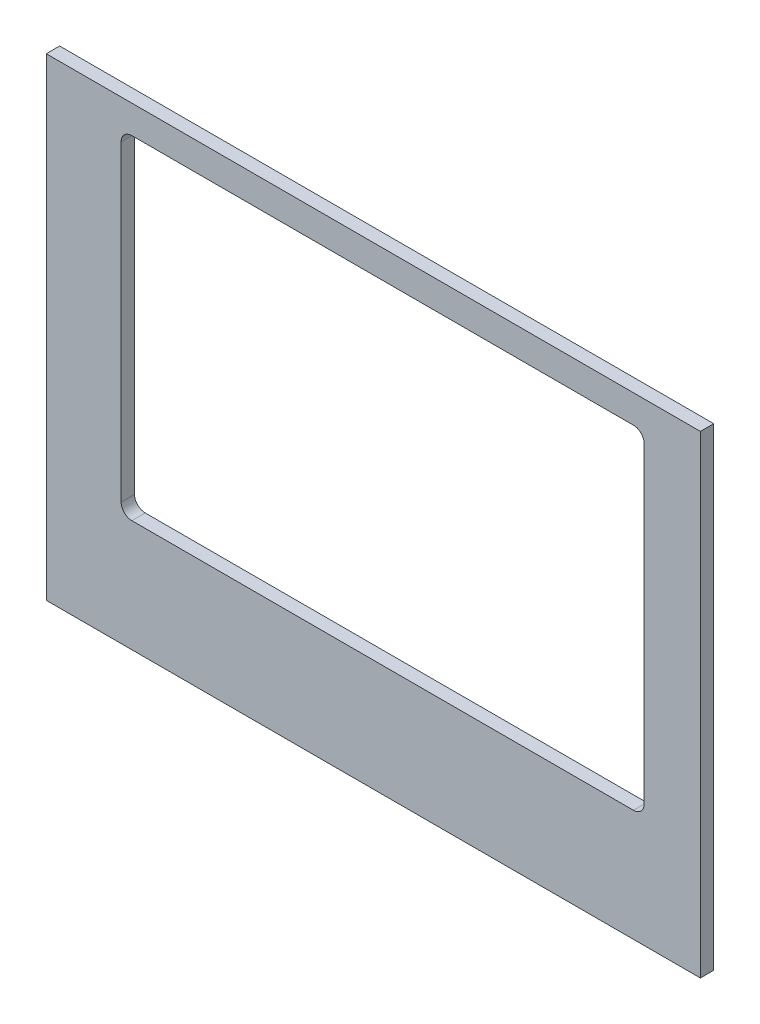
ISO-10303-21;
HEADER;
FILE_DESCRIPTION(('STEP AP214'),'2;1');
FILE_NAME('part.step','',(''),(''),'','','');
FILE_SCHEMA(('AUTOMOTIVE_DESIGN { 1 0 10303 214 1 1 1 1 }'));
ENDSEC;
DATA;
#1=APPLICATION_CONTEXT('core data for automotive mechanical design processes');
#2=APPLICATION_PROTOCOL_DEFINITION('international standard','automotive_design',2000,#1);
#3=PRODUCT_CONTEXT('',#1,'mechanical');
#4=PRODUCT('Part','Part','',(#3));
#5=PRODUCT_RELATED_PRODUCT_CATEGORY('part','',(#4));
#6=PRODUCT_DEFINITION_FORMATION('','',#4);
#7=PRODUCT_DEFINITION_CONTEXT('part definition',#1,'design');
#8=PRODUCT_DEFINITION('design','',#6,#7);
#9=PRODUCT_DEFINITION_SHAPE('','',#8);
#10=(LENGTH_UNIT() NAMED_UNIT(*) SI_UNIT(.MILLI.,.METRE.));
#11=(NAMED_UNIT(*) PLANE_ANGLE_UNIT() SI_UNIT($,.RADIAN.));
#12=(NAMED_UNIT(*) SI_UNIT($,.STERADIAN.) SOLID_ANGLE_UNIT());
#13=UNCERTAINTY_MEASURE_WITH_UNIT(LENGTH_MEASURE(1.E-05),#10,'distance_accuracy_value','');
#14=(GEOMETRIC_REPRESENTATION_CONTEXT(3) GLOBAL_UNCERTAINTY_ASSIGNED_CONTEXT((#13)) GLOBAL_UNIT_ASSIGNED_CONTEXT((#10,
#11,#12)) REPRESENTATION_CONTEXT('',''));
#15=CARTESIAN_POINT('',(0.,0.,0.));
#16=DIRECTION('',(0.,0.,1.));
#17=DIRECTION('',(1.,0.,0.));
#18=AXIS2_PLACEMENT_3D('',#15,#16,#17);
#19=CARTESIAN_POINT('',(-90.8525,56.1975,3.175));
#20=DIRECTION('',(0.,0.,-1.));
#21=DIRECTION('',(-1.,0.,0.));
#22=AXIS2_PLACEMENT_3D('',#19,#20,#21);
#23=PLANE('',#22);
#24=DIRECTION('',(-1.,0.,0.));
#25=VECTOR('',#24,1.);
#26=CARTESIAN_POINT('',(-7.10428994411308,56.1975,3.175));
#27=LINE('',#26,#25);
#28=CARTESIAN_POINT('',(64.4525000000002,56.1975,3.175));
#29=VERTEX_POINT('',#28);
#30=CARTESIAN_POINT('',(-90.8525,56.1975,3.175));
#31=VERTEX_POINT('',#30);
#32=EDGE_CURVE('E174',#29,#31,#27,.T.);
#33=ORIENTED_EDGE('',*,*,#32,.T.);
#34=DIRECTION('',(0.,-1.,0.));
#35=VECTOR('',#34,1.);
#36=CARTESIAN_POINT('',(-90.8525,5.30205394405902,3.175));
#37=LINE('',#36,#35);
#38=CARTESIAN_POINT('',(-90.8525,-56.1975,3.175));
#39=VERTEX_POINT('',#38);
#40=EDGE_CURVE('E127',#31,#39,#37,.T.);
#41=ORIENTED_EDGE('',*,*,#40,.T.);
#42=DIRECTION('',(1.,0.,0.));
#43=VECTOR('',#42,1.);
#44=CARTESIAN_POINT('',(2.61847178915045E-13,-56.1975,3.175));
#45=LINE('',#44,#43);
#46=CARTESIAN_POINT('',(64.4525000000003,-56.1975,3.175));
#47=VERTEX_POINT('',#46);
#48=EDGE_CURVE('E122',#39,#47,#45,.T.);
#49=ORIENTED_EDGE('',*,*,#48,.T.);
#50=DIRECTION('',(0.,-1.,0.));
#51=VECTOR('',#50,1.);
#52=CARTESIAN_POINT('',(64.4525000000002,56.1975,3.175));
#53=LINE('',#52,#51);
#54=EDGE_CURVE('E126',#29,#47,#53,.T.);
#55=ORIENTED_EDGE('',*,*,#54,.F.);
#56=EDGE_LOOP('',(#33,#41,#49,#55));
#57=FACE_BOUND('',#56,.T.);
#58=DIRECTION('',(0.,1.,0.));
#59=VECTOR('',#58,1.);
#60=CARTESIAN_POINT('',(51.1025,9.93499999999999,3.175));
#61=LINE('',#60,#59);
#62=CARTESIAN_POINT('',(51.1025,-27.1125,3.175));
#63=VERTEX_POINT('',#62);
#64=CARTESIAN_POINT('',(51.1025,46.9825,3.175));
#65=VERTEX_POINT('',#64);
#66=EDGE_CURVE('E151',#63,#65,#61,.T.);
#67=ORIENTED_EDGE('',*,*,#66,.F.);
#68=CARTESIAN_POINT('',(48.5625,-27.1125,3.175));
#69=DIRECTION('',(0.,0.,-1.));
#70=DIRECTION('',(-1.,0.,0.));
#71=AXIS2_PLACEMENT_3D('',#68,#69,#70);
#72=CIRCLE('',#71,2.54);
#73=CARTESIAN_POINT('',(48.5625,-29.6525,3.175));
#74=VERTEX_POINT('',#73);
#75=EDGE_CURVE('E212',#63,#74,#72,.T.);
#76=ORIENTED_EDGE('',*,*,#75,.T.);
#77=DIRECTION('',(1.,0.,0.));
#78=VECTOR('',#77,1.);
#79=CARTESIAN_POINT('',(-73.0725,-29.6525,3.175));
#80=LINE('',#79,#78);
#81=CARTESIAN_POINT('',(-70.5325,-29.6525,3.175));
#82=VERTEX_POINT('',#81);
#83=EDGE_CURVE('E160',#82,#74,#80,.T.);
#84=ORIENTED_EDGE('',*,*,#83,.F.);
#85=CARTESIAN_POINT('',(-70.5325,-27.1125,3.175));
#86=DIRECTION('',(0.,0.,-1.));
#87=DIRECTION('',(-1.,0.,0.));
#88=AXIS2_PLACEMENT_3D('',#85,#86,#87);
#89=CIRCLE('',#88,2.54);
#90=CARTESIAN_POINT('',(-73.0725,-27.1125,3.175));
#91=VERTEX_POINT('',#90);
#92=EDGE_CURVE('E208',#82,#91,#89,.T.);
#93=ORIENTED_EDGE('',*,*,#92,.T.);
#94=DIRECTION('',(0.,-1.,0.));
#95=VECTOR('',#94,1.);
#96=CARTESIAN_POINT('',(-73.0725,47.935,3.175));
#97=LINE('',#96,#95);
#98=CARTESIAN_POINT('',(-73.0725,46.9825,3.175));
#99=VERTEX_POINT('',#98);
#100=EDGE_CURVE('E157',#99,#91,#97,.T.);
#101=ORIENTED_EDGE('',*,*,#100,.F.);
#102=CARTESIAN_POINT('',(-70.5325,46.9825,3.175));
#103=DIRECTION('',(0.,0.,-1.));
#104=DIRECTION('',(-1.,0.,0.));
#105=AXIS2_PLACEMENT_3D('',#102,#103,#104);
#106=CIRCLE('',#105,2.54);
#107=CARTESIAN_POINT('',(-70.5325,49.5225,3.175));
#108=VERTEX_POINT('',#107);
#109=EDGE_CURVE('E11',#99,#108,#106,.T.);
#110=ORIENTED_EDGE('',*,*,#109,.T.);
#111=DIRECTION('',(-1.,0.,0.));
#112=VECTOR('',#111,1.);
#113=CARTESIAN_POINT('',(-10.985,49.5225,3.175));
#114=LINE('',#113,#112);
#115=CARTESIAN_POINT('',(48.5625,49.5225,3.175));
#116=VERTEX_POINT('',#115);
#117=EDGE_CURVE('E154',#116,#108,#114,.T.);
#118=ORIENTED_EDGE('',*,*,#117,.F.);
#119=CARTESIAN_POINT('',(48.5625,46.9825,3.175));
#120=DIRECTION('',(0.,0.,-1.));
#121=DIRECTION('',(-1.,0.,0.));
#122=AXIS2_PLACEMENT_3D('',#119,#120,#121);
#123=CIRCLE('',#122,2.54);
#124=EDGE_CURVE('E216',#116,#65,#123,.T.);
#125=ORIENTED_EDGE('',*,*,#124,.T.);
#126=EDGE_LOOP('',(#67,#76,#84,#93,#101,#110,#118,#125));
#127=FACE_BOUND('',#126,.T.);
#128=ADVANCED_FACE('F33',(#57,#127),#23,.F.);
#129=CARTESIAN_POINT('',(-90.8525,56.1975,0.));
#130=DIRECTION('',(0.,0.,-1.));
#131=DIRECTION('',(-1.,0.,0.));
#132=AXIS2_PLACEMENT_3D('',#129,#130,#131);
#133=PLANE('',#132);
#134=DIRECTION('',(0.,-1.,0.));
#135=VECTOR('',#134,1.);
#136=CARTESIAN_POINT('',(-90.8525,5.30205394405902,0.));
#137=LINE('',#136,#135);
#138=CARTESIAN_POINT('',(-90.8525,56.1975,0.));
#139=VERTEX_POINT('',#138);
#140=CARTESIAN_POINT('',(-90.8525,-56.1975,0.));
#141=VERTEX_POINT('',#140);
#142=EDGE_CURVE('E163',#139,#141,#137,.T.);
#143=ORIENTED_EDGE('',*,*,#142,.F.);
#144=DIRECTION('',(-1.,0.,0.));
#145=VECTOR('',#144,1.);
#146=CARTESIAN_POINT('',(-7.10428994411308,56.1975,0.));
#147=LINE('',#146,#145);
#148=CARTESIAN_POINT('',(64.4525000000002,56.1975,0.));
#149=VERTEX_POINT('',#148);
#150=EDGE_CURVE('E176',#149,#139,#147,.T.);
#151=ORIENTED_EDGE('',*,*,#150,.F.);
#152=DIRECTION('',(0.,1.,0.));
#153=VECTOR('',#152,1.);
#154=CARTESIAN_POINT('',(64.4525000000002,56.1975,0.));
#155=LINE('',#154,#153);
#156=CARTESIAN_POINT('',(64.4525000000003,-56.1975,0.));
#157=VERTEX_POINT('',#156);
#158=EDGE_CURVE('E140',#157,#149,#155,.T.);
#159=ORIENTED_EDGE('',*,*,#158,.F.);
#160=DIRECTION('',(1.,0.,0.));
#161=VECTOR('',#160,1.);
#162=CARTESIAN_POINT('',(61.2775000000003,-56.1975,0.));
#163=LINE('',#162,#161);
#164=EDGE_CURVE('E136',#141,#157,#163,.T.);
#165=ORIENTED_EDGE('',*,*,#164,.F.);
#166=EDGE_LOOP('',(#143,#151,#159,#165));
#167=FACE_BOUND('',#166,.T.);
#168=DIRECTION('',(0.,-1.,0.));
#169=VECTOR('',#168,1.);
#170=CARTESIAN_POINT('',(-73.0725,-29.6525,0.));
#171=LINE('',#170,#169);
#172=CARTESIAN_POINT('',(-73.0725,46.9825,0.));
#173=VERTEX_POINT('',#172);
#174=CARTESIAN_POINT('',(-73.0725,-27.1125,0.));
#175=VERTEX_POINT('',#174);
#176=EDGE_CURVE('E169',#173,#175,#171,.T.);
#177=ORIENTED_EDGE('',*,*,#176,.T.);
#178=CARTESIAN_POINT('',(-70.5325,-27.1125,0.));
#179=DIRECTION('',(0.,0.,-1.));
#180=DIRECTION('',(-1.,0.,0.));
#181=AXIS2_PLACEMENT_3D('',#178,#179,#180);
#182=CIRCLE('',#181,2.54);
#183=CARTESIAN_POINT('',(-70.5325,-29.6525,0.));
#184=VERTEX_POINT('',#183);
#185=EDGE_CURVE('E206',#175,#184,#182,.F.);
#186=ORIENTED_EDGE('',*,*,#185,.T.);
#187=DIRECTION('',(1.,0.,0.));
#188=VECTOR('',#187,1.);
#189=CARTESIAN_POINT('',(51.1025,-29.6525,0.));
#190=LINE('',#189,#188);
#191=CARTESIAN_POINT('',(48.5625,-29.6525,0.));
#192=VERTEX_POINT('',#191);
#193=EDGE_CURVE('E155',#184,#192,#190,.T.);
#194=ORIENTED_EDGE('',*,*,#193,.T.);
#195=CARTESIAN_POINT('',(48.5625,-27.1125,0.));
#196=DIRECTION('',(0.,0.,-1.));
#197=DIRECTION('',(-1.,0.,0.));
#198=AXIS2_PLACEMENT_3D('',#195,#196,#197);
#199=CIRCLE('',#198,2.54);
#200=CARTESIAN_POINT('',(51.1025,-27.1125,0.));
#201=VERTEX_POINT('',#200);
#202=EDGE_CURVE('E210',#192,#201,#199,.F.);
#203=ORIENTED_EDGE('',*,*,#202,.T.);
#204=DIRECTION('',(0.,1.,0.));
#205=VECTOR('',#204,1.);
#206=CARTESIAN_POINT('',(51.1025,49.5225,0.));
#207=LINE('',#206,#205);
#208=CARTESIAN_POINT('',(51.1025,46.9825,0.));
#209=VERTEX_POINT('',#208);
#210=EDGE_CURVE('E150',#201,#209,#207,.T.);
#211=ORIENTED_EDGE('',*,*,#210,.T.);
#212=CARTESIAN_POINT('',(48.5625,46.9825,0.));
#213=DIRECTION('',(0.,0.,-1.));
#214=DIRECTION('',(-1.,0.,0.));
#215=AXIS2_PLACEMENT_3D('',#212,#213,#214);
#216=CIRCLE('',#215,2.54);
#217=CARTESIAN_POINT('',(48.5625,49.5225,0.));
#218=VERTEX_POINT('',#217);
#219=EDGE_CURVE('E214',#209,#218,#216,.F.);
#220=ORIENTED_EDGE('',*,*,#219,.T.);
#221=DIRECTION('',(-1.,0.,0.));
#222=VECTOR('',#221,1.);
#223=CARTESIAN_POINT('',(-73.0725,49.5225,0.));
#224=LINE('',#223,#222);
#225=CARTESIAN_POINT('',(-70.5325,49.5225,0.));
#226=VERTEX_POINT('',#225);
#227=EDGE_CURVE('E166',#218,#226,#224,.T.);
#228=ORIENTED_EDGE('',*,*,#227,.T.);
#229=CARTESIAN_POINT('',(-70.5325,46.9825,0.));
#230=DIRECTION('',(0.,0.,-1.));
#231=DIRECTION('',(-1.,0.,0.));
#232=AXIS2_PLACEMENT_3D('',#229,#230,#231);
#233=CIRCLE('',#232,2.54);
#234=EDGE_CURVE('E41',#226,#173,#233,.F.);
#235=ORIENTED_EDGE('',*,*,#234,.T.);
#236=EDGE_LOOP('',(#177,#186,#194,#203,#211,#220,#228,#235));
#237=FACE_BOUND('',#236,.T.);
#238=ADVANCED_FACE('F219',(#167,#237),#133,.T.);
#239=CARTESIAN_POINT('',(-90.8525,5.30205394405902,3.175));
#240=DIRECTION('',(1.,0.,0.));
#241=DIRECTION('',(0.,1.,0.));
#242=AXIS2_PLACEMENT_3D('',#239,#240,#241);
#243=PLANE('',#242);
#244=ORIENTED_EDGE('',*,*,#142,.T.);
#245=DIRECTION('',(0.,0.,-1.));
#246=VECTOR('',#245,1.);
#247=CARTESIAN_POINT('',(-90.8525,-56.1975,3.175));
#248=LINE('',#247,#246);
#249=EDGE_CURVE('E131',#39,#141,#248,.T.);
#250=ORIENTED_EDGE('',*,*,#249,.F.);
#251=ORIENTED_EDGE('',*,*,#40,.F.);
#252=DIRECTION('',(0.,0.,-1.));
#253=VECTOR('',#252,1.);
#254=CARTESIAN_POINT('',(-90.8525,56.1975,3.175));
#255=LINE('',#254,#253);
#256=EDGE_CURVE('E184',#31,#139,#255,.T.);
#257=ORIENTED_EDGE('',*,*,#256,.T.);
#258=EDGE_LOOP('',(#244,#250,#251,#257));
#259=FACE_BOUND('',#258,.T.);
#260=ADVANCED_FACE('F263',(#259),#243,.F.);
#261=CARTESIAN_POINT('',(61.2775000000003,-56.1975,3.175));
#262=DIRECTION('',(0.,1.,0.));
#263=DIRECTION('',(-1.,0.,0.));
#264=AXIS2_PLACEMENT_3D('',#261,#262,#263);
#265=PLANE('',#264);
#266=ORIENTED_EDGE('',*,*,#164,.T.);
#267=DIRECTION('',(0.,0.,-1.));
#268=VECTOR('',#267,1.);
#269=CARTESIAN_POINT('',(64.4525000000003,-56.1975,3.175));
#270=LINE('',#269,#268);
#271=EDGE_CURVE('E134',#47,#157,#270,.T.);
#272=ORIENTED_EDGE('',*,*,#271,.F.);
#273=ORIENTED_EDGE('',*,*,#48,.F.);
#274=ORIENTED_EDGE('',*,*,#249,.T.);
#275=EDGE_LOOP('',(#266,#272,#273,#274));
#276=FACE_BOUND('',#275,.T.);
#277=ADVANCED_FACE('F135',(#276),#265,.F.);
#278=CARTESIAN_POINT('',(-7.10428994411308,56.1975,3.175));
#279=DIRECTION('',(0.,-1.,0.));
#280=DIRECTION('',(1.,0.,0.));
#281=AXIS2_PLACEMENT_3D('',#278,#279,#280);
#282=PLANE('',#281);
#283=ORIENTED_EDGE('',*,*,#150,.T.);
#284=ORIENTED_EDGE('',*,*,#256,.F.);
#285=ORIENTED_EDGE('',*,*,#32,.F.);
#286=DIRECTION('',(0.,0.,1.));
#287=VECTOR('',#286,1.);
#288=CARTESIAN_POINT('',(64.4525000000002,56.1975,3.175));
#289=LINE('',#288,#287);
#290=EDGE_CURVE('E145',#149,#29,#289,.T.);
#291=ORIENTED_EDGE('',*,*,#290,.F.);
#292=EDGE_LOOP('',(#283,#284,#285,#291));
#293=FACE_BOUND('',#292,.T.);
#294=ADVANCED_FACE('F269',(#293),#282,.F.);
#295=CARTESIAN_POINT('',(51.1025,49.5225,3.175));
#296=DIRECTION('',(-1.,0.,0.));
#297=DIRECTION('',(0.,0.,1.));
#298=AXIS2_PLACEMENT_3D('',#295,#296,#297);
#299=PLANE('',#298);
#300=ORIENTED_EDGE('',*,*,#210,.F.);
#301=DIRECTION('',(0.,0.,-1.));
#302=VECTOR('',#301,1.);
#303=CARTESIAN_POINT('',(51.1025,-27.1125,3.175));
#304=LINE('',#303,#302);
#305=EDGE_CURVE('E200',#201,#63,#304,.F.);
#306=ORIENTED_EDGE('',*,*,#305,.T.);
#307=ORIENTED_EDGE('',*,*,#66,.T.);
#308=DIRECTION('',(0.,0.,-1.));
#309=VECTOR('',#308,1.);
#310=CARTESIAN_POINT('',(51.1025,46.9825,0.));
#311=LINE('',#310,#309);
#312=EDGE_CURVE('E197',#65,#209,#311,.T.);
#313=ORIENTED_EDGE('',*,*,#312,.T.);
#314=EDGE_LOOP('',(#300,#306,#307,#313));
#315=FACE_BOUND('',#314,.T.);
#316=ADVANCED_FACE('F234',(#315),#299,.T.);
#317=CARTESIAN_POINT('',(-73.0725,49.5225,3.175));
#318=DIRECTION('',(0.,-1.,0.));
#319=DIRECTION('',(0.,0.,-1.));
#320=AXIS2_PLACEMENT_3D('',#317,#318,#319);
#321=PLANE('',#320);
#322=ORIENTED_EDGE('',*,*,#227,.F.);
#323=DIRECTION('',(0.,0.,-1.));
#324=VECTOR('',#323,1.);
#325=CARTESIAN_POINT('',(48.5625,49.5225,3.175));
#326=LINE('',#325,#324);
#327=EDGE_CURVE('E53',#218,#116,#326,.F.);
#328=ORIENTED_EDGE('',*,*,#327,.T.);
#329=ORIENTED_EDGE('',*,*,#117,.T.);
#330=DIRECTION('',(0.,0.,-1.));
#331=VECTOR('',#330,1.);
#332=CARTESIAN_POINT('',(-70.5325,49.5225,0.));
#333=LINE('',#332,#331);
#334=EDGE_CURVE('E202',#108,#226,#333,.T.);
#335=ORIENTED_EDGE('',*,*,#334,.T.);
#336=EDGE_LOOP('',(#322,#328,#329,#335));
#337=FACE_BOUND('',#336,.T.);
#338=ADVANCED_FACE('F226',(#337),#321,.T.);
#339=CARTESIAN_POINT('',(-73.0725,-29.6525,3.175));
#340=DIRECTION('',(1.,0.,0.));
#341=DIRECTION('',(0.,0.,-1.));
#342=AXIS2_PLACEMENT_3D('',#339,#340,#341);
#343=PLANE('',#342);
#344=ORIENTED_EDGE('',*,*,#100,.T.);
#345=DIRECTION('',(0.,0.,-1.));
#346=VECTOR('',#345,1.);
#347=CARTESIAN_POINT('',(-73.0725,-27.1125,0.));
#348=LINE('',#347,#346);
#349=EDGE_CURVE('E189',#91,#175,#348,.T.);
#350=ORIENTED_EDGE('',*,*,#349,.T.);
#351=ORIENTED_EDGE('',*,*,#176,.F.);
#352=DIRECTION('',(0.,0.,-1.));
#353=VECTOR('',#352,1.);
#354=CARTESIAN_POINT('',(-73.0725,46.9825,3.175));
#355=LINE('',#354,#353);
#356=EDGE_CURVE('E187',#173,#99,#355,.F.);
#357=ORIENTED_EDGE('',*,*,#356,.T.);
#358=EDGE_LOOP('',(#344,#350,#351,#357));
#359=FACE_BOUND('',#358,.T.);
#360=ADVANCED_FACE('F224',(#359),#343,.T.);
#361=CARTESIAN_POINT('',(51.1025,-29.6525,3.175));
#362=DIRECTION('',(0.,1.,0.));
#363=DIRECTION('',(0.,0.,1.));
#364=AXIS2_PLACEMENT_3D('',#361,#362,#363);
#365=PLANE('',#364);
#366=ORIENTED_EDGE('',*,*,#193,.F.);
#367=DIRECTION('',(0.,0.,-1.));
#368=VECTOR('',#367,1.);
#369=CARTESIAN_POINT('',(-70.5325,-29.6525,3.175));
#370=LINE('',#369,#368);
#371=EDGE_CURVE('E195',#184,#82,#370,.F.);
#372=ORIENTED_EDGE('',*,*,#371,.T.);
#373=ORIENTED_EDGE('',*,*,#83,.T.);
#374=DIRECTION('',(0.,0.,-1.));
#375=VECTOR('',#374,1.);
#376=CARTESIAN_POINT('',(48.5625,-29.6525,0.));
#377=LINE('',#376,#375);
#378=EDGE_CURVE('E192',#74,#192,#377,.T.);
#379=ORIENTED_EDGE('',*,*,#378,.T.);
#380=EDGE_LOOP('',(#366,#372,#373,#379));
#381=FACE_BOUND('',#380,.T.);
#382=ADVANCED_FACE('F242',(#381),#365,.T.);
#383=CARTESIAN_POINT('',(64.4525000000003,-56.1975,3.175));
#384=DIRECTION('',(1.,0.,0.));
#385=DIRECTION('',(0.,1.,0.));
#386=AXIS2_PLACEMENT_3D('',#383,#384,#385);
#387=PLANE('',#386);
#388=ORIENTED_EDGE('',*,*,#54,.T.);
#389=ORIENTED_EDGE('',*,*,#271,.T.);
#390=ORIENTED_EDGE('',*,*,#158,.T.);
#391=ORIENTED_EDGE('',*,*,#290,.T.);
#392=EDGE_LOOP('',(#388,#389,#390,#391));
#393=FACE_BOUND('',#392,.T.);
#394=ADVANCED_FACE('F143',(#393),#387,.T.);
#395=CARTESIAN_POINT('',(-70.5325,-27.1125,3.175));
#396=DIRECTION('',(0.,0.,1.));
#397=DIRECTION('',(1.,0.,0.));
#398=AXIS2_PLACEMENT_3D('',#395,#396,#397);
#399=CYLINDRICAL_SURFACE('',#398,2.54);
#400=ORIENTED_EDGE('',*,*,#92,.F.);
#401=ORIENTED_EDGE('',*,*,#371,.F.);
#402=ORIENTED_EDGE('',*,*,#185,.F.);
#403=ORIENTED_EDGE('',*,*,#349,.F.);
#404=EDGE_LOOP('',(#400,#401,#402,#403));
#405=FACE_BOUND('',#404,.T.);
#406=ADVANCED_FACE('F247',(#405),#399,.F.);
#407=CARTESIAN_POINT('',(48.5625,-27.1125,3.175));
#408=DIRECTION('',(0.,0.,1.));
#409=DIRECTION('',(1.,0.,0.));
#410=AXIS2_PLACEMENT_3D('',#407,#408,#409);
#411=CYLINDRICAL_SURFACE('',#410,2.54);
#412=ORIENTED_EDGE('',*,*,#75,.F.);
#413=ORIENTED_EDGE('',*,*,#305,.F.);
#414=ORIENTED_EDGE('',*,*,#202,.F.);
#415=ORIENTED_EDGE('',*,*,#378,.F.);
#416=EDGE_LOOP('',(#412,#413,#414,#415));
#417=FACE_BOUND('',#416,.T.);
#418=ADVANCED_FACE('F240',(#417),#411,.F.);
#419=CARTESIAN_POINT('',(48.5625,46.9825,3.175));
#420=DIRECTION('',(0.,0.,1.));
#421=DIRECTION('',(1.,0.,0.));
#422=AXIS2_PLACEMENT_3D('',#419,#420,#421);
#423=CYLINDRICAL_SURFACE('',#422,2.54);
#424=ORIENTED_EDGE('',*,*,#124,.F.);
#425=ORIENTED_EDGE('',*,*,#327,.F.);
#426=ORIENTED_EDGE('',*,*,#219,.F.);
#427=ORIENTED_EDGE('',*,*,#312,.F.);
#428=EDGE_LOOP('',(#424,#425,#426,#427));
#429=FACE_BOUND('',#428,.T.);
#430=ADVANCED_FACE('F231',(#429),#423,.F.);
#431=CARTESIAN_POINT('',(-70.5325,46.9825,3.175));
#432=DIRECTION('',(0.,0.,1.));
#433=DIRECTION('',(1.,0.,0.));
#434=AXIS2_PLACEMENT_3D('',#431,#432,#433);
#435=CYLINDRICAL_SURFACE('',#434,2.54);
#436=ORIENTED_EDGE('',*,*,#109,.F.);
#437=ORIENTED_EDGE('',*,*,#356,.F.);
#438=ORIENTED_EDGE('',*,*,#234,.F.);
#439=ORIENTED_EDGE('',*,*,#334,.F.);
#440=EDGE_LOOP('',(#436,#437,#438,#439));
#441=FACE_BOUND('',#440,.T.);
#442=ADVANCED_FACE('F35',(#441),#435,.F.);
#443=CLOSED_SHELL('',(#128,#238,#260,#277,#294,#316,#338,#360,#382,#394,#406,#418,#430,#442));
#444=MANIFOLD_SOLID_BREP('B2',#443);
#445=ADVANCED_BREP_SHAPE_REPRESENTATION('',(#18,#444),#14);
#446=SHAPE_DEFINITION_REPRESENTATION(#9,#445);
ENDSEC;
END-ISO-10303-21;
